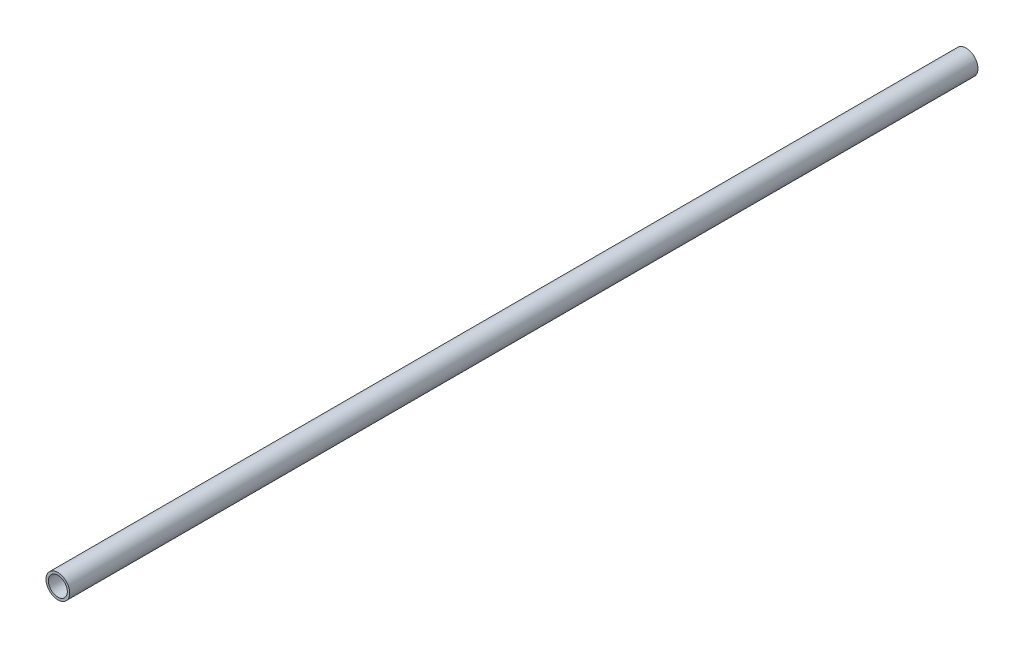
ISO-10303-21;
HEADER;
FILE_DESCRIPTION(('STEP AP214'),'2;1');
FILE_NAME('part.step','',(''),(''),'','','');
FILE_SCHEMA(('AUTOMOTIVE_DESIGN { 1 0 10303 214 1 1 1 1 }'));
ENDSEC;
DATA;
#1=APPLICATION_CONTEXT('core data for automotive mechanical design processes');
#2=APPLICATION_PROTOCOL_DEFINITION('international standard','automotive_design',2000,#1);
#3=PRODUCT_CONTEXT('',#1,'mechanical');
#4=PRODUCT('Part','Part','',(#3));
#5=PRODUCT_RELATED_PRODUCT_CATEGORY('part','',(#4));
#6=PRODUCT_DEFINITION_FORMATION('','',#4);
#7=PRODUCT_DEFINITION_CONTEXT('part definition',#1,'design');
#8=PRODUCT_DEFINITION('design','',#6,#7);
#9=PRODUCT_DEFINITION_SHAPE('','',#8);
#10=(LENGTH_UNIT() NAMED_UNIT(*) SI_UNIT(.MILLI.,.METRE.));
#11=(NAMED_UNIT(*) PLANE_ANGLE_UNIT() SI_UNIT($,.RADIAN.));
#12=(NAMED_UNIT(*) SI_UNIT($,.STERADIAN.) SOLID_ANGLE_UNIT());
#13=UNCERTAINTY_MEASURE_WITH_UNIT(LENGTH_MEASURE(1.E-05),#10,'distance_accuracy_value','');
#14=(GEOMETRIC_REPRESENTATION_CONTEXT(3) GLOBAL_UNCERTAINTY_ASSIGNED_CONTEXT((#13)) GLOBAL_UNIT_ASSIGNED_CONTEXT((#10,
#11,#12)) REPRESENTATION_CONTEXT('',''));
#15=CARTESIAN_POINT('',(0.,0.,0.));
#16=DIRECTION('',(0.,0.,1.));
#17=DIRECTION('',(1.,0.,0.));
#18=AXIS2_PLACEMENT_3D('',#15,#16,#17);
#19=CARTESIAN_POINT('',(0.,0.,-1278.128));
#20=DIRECTION('',(0.,0.,1.));
#21=DIRECTION('',(1.,0.,0.));
#22=AXIS2_PLACEMENT_3D('',#19,#20,#21);
#23=CYLINDRICAL_SURFACE('',#22,16.7005);
#24=CARTESIAN_POINT('',(0.,0.,-1278.128));
#25=DIRECTION('',(0.,0.,1.));
#26=DIRECTION('',(1.,0.,0.));
#27=AXIS2_PLACEMENT_3D('',#24,#25,#26);
#28=CIRCLE('',#27,16.7005);
#29=CARTESIAN_POINT('',(16.7005,0.,-1278.128));
#30=VERTEX_POINT('',#29);
#31=EDGE_CURVE('E10',#30,#30,#28,.T.);
#32=ORIENTED_EDGE('',*,*,#31,.T.);
#33=EDGE_LOOP('',(#32));
#34=FACE_BOUND('',#33,.T.);
#35=CARTESIAN_POINT('',(0.,0.,0.));
#36=DIRECTION('',(0.,0.,1.));
#37=DIRECTION('',(1.,0.,0.));
#38=AXIS2_PLACEMENT_3D('',#35,#36,#37);
#39=CIRCLE('',#38,16.7005);
#40=CARTESIAN_POINT('',(16.7005,0.,0.));
#41=VERTEX_POINT('',#40);
#42=EDGE_CURVE('E37',#41,#41,#39,.T.);
#43=ORIENTED_EDGE('',*,*,#42,.F.);
#44=EDGE_LOOP('',(#43));
#45=FACE_BOUND('',#44,.T.);
#46=ADVANCED_FACE('F34',(#34,#45),#23,.T.);
#47=CARTESIAN_POINT('',(0.,0.,-1278.128));
#48=DIRECTION('',(0.,0.,1.));
#49=DIRECTION('',(1.,0.,0.));
#50=AXIS2_PLACEMENT_3D('',#47,#48,#49);
#51=PLANE('',#50);
#52=CARTESIAN_POINT('',(0.,0.,-1278.128));
#53=DIRECTION('',(0.,0.,1.));
#54=DIRECTION('',(1.,0.,0.));
#55=AXIS2_PLACEMENT_3D('',#52,#53,#54);
#56=CIRCLE('',#55,13.3223);
#57=CARTESIAN_POINT('',(13.3223,0.,-1278.128));
#58=VERTEX_POINT('',#57);
#59=EDGE_CURVE('E44',#58,#58,#56,.T.);
#60=ORIENTED_EDGE('',*,*,#59,.T.);
#61=EDGE_LOOP('',(#60));
#62=FACE_BOUND('',#61,.T.);
#63=ORIENTED_EDGE('',*,*,#31,.F.);
#64=EDGE_LOOP('',(#63));
#65=FACE_BOUND('',#64,.T.);
#66=ADVANCED_FACE('F52',(#62,#65),#51,.F.);
#67=CARTESIAN_POINT('',(0.,0.,0.));
#68=DIRECTION('',(0.,0.,1.));
#69=DIRECTION('',(1.,0.,0.));
#70=AXIS2_PLACEMENT_3D('',#67,#68,#69);
#71=PLANE('',#70);
#72=CARTESIAN_POINT('',(0.,0.,0.));
#73=DIRECTION('',(0.,0.,1.));
#74=DIRECTION('',(1.,0.,0.));
#75=AXIS2_PLACEMENT_3D('',#72,#73,#74);
#76=CIRCLE('',#75,13.3223);
#77=CARTESIAN_POINT('',(13.3223,0.,0.));
#78=VERTEX_POINT('',#77);
#79=EDGE_CURVE('E46',#78,#78,#76,.T.);
#80=ORIENTED_EDGE('',*,*,#79,.F.);
#81=EDGE_LOOP('',(#80));
#82=FACE_BOUND('',#81,.T.);
#83=ORIENTED_EDGE('',*,*,#42,.T.);
#84=EDGE_LOOP('',(#83));
#85=FACE_BOUND('',#84,.T.);
#86=ADVANCED_FACE('F58',(#82,#85),#71,.T.);
#87=CARTESIAN_POINT('',(0.,0.,-1278.128));
#88=DIRECTION('',(0.,0.,1.));
#89=DIRECTION('',(1.,0.,0.));
#90=AXIS2_PLACEMENT_3D('',#87,#88,#89);
#91=CYLINDRICAL_SURFACE('',#90,13.3223);
#92=ORIENTED_EDGE('',*,*,#59,.F.);
#93=EDGE_LOOP('',(#92));
#94=FACE_BOUND('',#93,.T.);
#95=ORIENTED_EDGE('',*,*,#79,.T.);
#96=EDGE_LOOP('',(#95));
#97=FACE_BOUND('',#96,.T.);
#98=ADVANCED_FACE('F55',(#94,#97),#91,.F.);
#99=CLOSED_SHELL('',(#46,#66,#86,#98));
#100=MANIFOLD_SOLID_BREP('B2',#99);
#101=ADVANCED_BREP_SHAPE_REPRESENTATION('',(#18,#100),#14);
#102=SHAPE_DEFINITION_REPRESENTATION(#9,#101);
ENDSEC;
END-ISO-10303-21;
